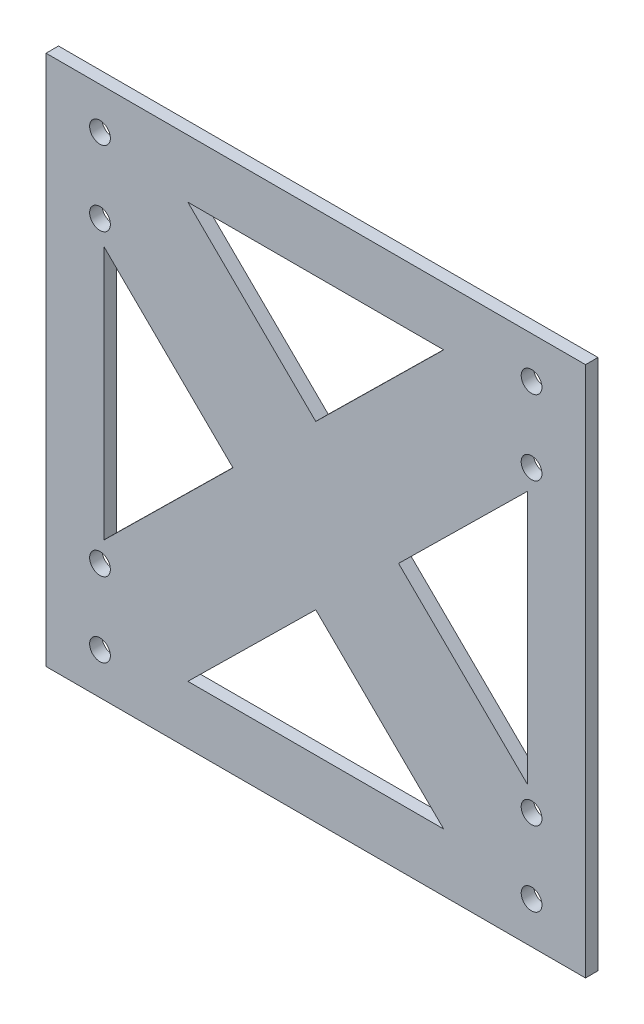
ISO-10303-21;
HEADER;
FILE_DESCRIPTION(('STEP AP214'),'2;1');
FILE_NAME('part.step','',(''),(''),'','','');
FILE_SCHEMA(('AUTOMOTIVE_DESIGN { 1 0 10303 214 1 1 1 1 }'));
ENDSEC;
DATA;
#1=APPLICATION_CONTEXT('core data for automotive mechanical design processes');
#2=APPLICATION_PROTOCOL_DEFINITION('international standard','automotive_design',2000,#1);
#3=PRODUCT_CONTEXT('',#1,'mechanical');
#4=PRODUCT('Part','Part','',(#3));
#5=PRODUCT_RELATED_PRODUCT_CATEGORY('part','',(#4));
#6=PRODUCT_DEFINITION_FORMATION('','',#4);
#7=PRODUCT_DEFINITION_CONTEXT('part definition',#1,'design');
#8=PRODUCT_DEFINITION('design','',#6,#7);
#9=PRODUCT_DEFINITION_SHAPE('','',#8);
#10=(LENGTH_UNIT() NAMED_UNIT(*) SI_UNIT(.MILLI.,.METRE.));
#11=(NAMED_UNIT(*) PLANE_ANGLE_UNIT() SI_UNIT($,.RADIAN.));
#12=(NAMED_UNIT(*) SI_UNIT($,.STERADIAN.) SOLID_ANGLE_UNIT());
#13=UNCERTAINTY_MEASURE_WITH_UNIT(LENGTH_MEASURE(1.E-05),#10,'distance_accuracy_value','');
#14=(GEOMETRIC_REPRESENTATION_CONTEXT(3) GLOBAL_UNCERTAINTY_ASSIGNED_CONTEXT((#13)) GLOBAL_UNIT_ASSIGNED_CONTEXT((#10,
#11,#12)) REPRESENTATION_CONTEXT('',''));
#15=CARTESIAN_POINT('',(0.,0.,0.));
#16=DIRECTION('',(0.,0.,1.));
#17=DIRECTION('',(1.,0.,0.));
#18=AXIS2_PLACEMENT_3D('',#15,#16,#17);
#19=CARTESIAN_POINT('',(0.,0.,3.));
#20=DIRECTION('',(0.,0.,-1.));
#21=DIRECTION('',(-1.,0.,0.));
#22=AXIS2_PLACEMENT_3D('',#19,#20,#21);
#23=PLANE('',#22);
#24=CARTESIAN_POINT('',(52.,36.,3.));
#25=DIRECTION('',(0.,0.,-1.));
#26=DIRECTION('',(-1.,0.,0.));
#27=AXIS2_PLACEMENT_3D('',#24,#25,#26);
#28=CIRCLE('',#27,2.5);
#29=CARTESIAN_POINT('',(49.5,36.,3.));
#30=VERTEX_POINT('',#29);
#31=EDGE_CURVE('E511',#30,#30,#28,.T.);
#32=ORIENTED_EDGE('',*,*,#31,.T.);
#33=EDGE_LOOP('',(#32));
#34=FACE_BOUND('',#33,.T.);
#35=CARTESIAN_POINT('',(-52.,-36.,3.));
#36=DIRECTION('',(0.,0.,-1.));
#37=DIRECTION('',(-1.,0.,0.));
#38=AXIS2_PLACEMENT_3D('',#35,#36,#37);
#39=CIRCLE('',#38,2.5);
#40=CARTESIAN_POINT('',(-54.5,-36.,3.));
#41=VERTEX_POINT('',#40);
#42=EDGE_CURVE('E515',#41,#41,#39,.T.);
#43=ORIENTED_EDGE('',*,*,#42,.T.);
#44=EDGE_LOOP('',(#43));
#45=FACE_BOUND('',#44,.T.);
#46=CARTESIAN_POINT('',(-52.,-54.,3.));
#47=DIRECTION('',(0.,0.,-1.));
#48=DIRECTION('',(-1.,0.,0.));
#49=AXIS2_PLACEMENT_3D('',#46,#47,#48);
#50=CIRCLE('',#49,2.5);
#51=CARTESIAN_POINT('',(-54.5,-54.,3.));
#52=VERTEX_POINT('',#51);
#53=EDGE_CURVE('E534',#52,#52,#50,.T.);
#54=ORIENTED_EDGE('',*,*,#53,.T.);
#55=EDGE_LOOP('',(#54));
#56=FACE_BOUND('',#55,.T.);
#57=CARTESIAN_POINT('',(52.,-36.,3.));
#58=DIRECTION('',(0.,0.,-1.));
#59=DIRECTION('',(-1.,0.,0.));
#60=AXIS2_PLACEMENT_3D('',#57,#58,#59);
#61=CIRCLE('',#60,2.5);
#62=CARTESIAN_POINT('',(49.5,-36.,3.));
#63=VERTEX_POINT('',#62);
#64=EDGE_CURVE('E528',#63,#63,#61,.T.);
#65=ORIENTED_EDGE('',*,*,#64,.T.);
#66=EDGE_LOOP('',(#65));
#67=FACE_BOUND('',#66,.T.);
#68=CARTESIAN_POINT('',(52.,54.,3.));
#69=DIRECTION('',(0.,0.,-1.));
#70=DIRECTION('',(-1.,0.,0.));
#71=AXIS2_PLACEMENT_3D('',#68,#69,#70);
#72=CIRCLE('',#71,2.5);
#73=CARTESIAN_POINT('',(49.5,54.,3.));
#74=VERTEX_POINT('',#73);
#75=EDGE_CURVE('E568',#74,#74,#72,.T.);
#76=ORIENTED_EDGE('',*,*,#75,.T.);
#77=EDGE_LOOP('',(#76));
#78=FACE_BOUND('',#77,.T.);
#79=CARTESIAN_POINT('',(-52.,54.,3.));
#80=DIRECTION('',(0.,0.,-1.));
#81=DIRECTION('',(-1.,0.,0.));
#82=AXIS2_PLACEMENT_3D('',#79,#80,#81);
#83=CIRCLE('',#82,2.5);
#84=CARTESIAN_POINT('',(-54.5,54.,3.));
#85=VERTEX_POINT('',#84);
#86=EDGE_CURVE('E562',#85,#85,#83,.T.);
#87=ORIENTED_EDGE('',*,*,#86,.T.);
#88=EDGE_LOOP('',(#87));
#89=FACE_BOUND('',#88,.T.);
#90=CARTESIAN_POINT('',(-52.,36.,3.));
#91=DIRECTION('',(0.,0.,-1.));
#92=DIRECTION('',(-1.,0.,0.));
#93=AXIS2_PLACEMENT_3D('',#90,#91,#92);
#94=CIRCLE('',#93,2.5);
#95=CARTESIAN_POINT('',(-54.5,36.,3.));
#96=VERTEX_POINT('',#95);
#97=EDGE_CURVE('E556',#96,#96,#94,.T.);
#98=ORIENTED_EDGE('',*,*,#97,.T.);
#99=EDGE_LOOP('',(#98));
#100=FACE_BOUND('',#99,.T.);
#101=CARTESIAN_POINT('',(52.,-54.,3.));
#102=DIRECTION('',(0.,0.,-1.));
#103=DIRECTION('',(-1.,0.,0.));
#104=AXIS2_PLACEMENT_3D('',#101,#102,#103);
#105=CIRCLE('',#104,2.5);
#106=CARTESIAN_POINT('',(49.5,-54.,3.));
#107=VERTEX_POINT('',#106);
#108=EDGE_CURVE('E172',#107,#107,#105,.T.);
#109=ORIENTED_EDGE('',*,*,#108,.T.);
#110=EDGE_LOOP('',(#109));
#111=FACE_BOUND('',#110,.T.);
#112=DIRECTION('',(0.712566819448411,-0.701604252995359,0.));
#113=VECTOR('',#112,1.);
#114=CARTESIAN_POINT('',(51.,-30.5681043633554,3.));
#115=LINE('',#114,#113);
#116=CARTESIAN_POINT('',(19.9542690059671,0.,3.));
#117=VERTEX_POINT('',#116);
#118=CARTESIAN_POINT('',(51.,-30.5681043633554,3.));
#119=VERTEX_POINT('',#118);
#120=EDGE_CURVE('E178',#117,#119,#115,.T.);
#121=ORIENTED_EDGE('',*,*,#120,.F.);
#122=DIRECTION('',(-0.712566819448411,-0.701604252995359,0.));
#123=VECTOR('',#122,1.);
#124=CARTESIAN_POINT('',(19.9542690059671,0.,3.));
#125=LINE('',#124,#123);
#126=CARTESIAN_POINT('',(51.,30.5681043633554,3.));
#127=VERTEX_POINT('',#126);
#128=EDGE_CURVE('E184',#127,#117,#125,.T.);
#129=ORIENTED_EDGE('',*,*,#128,.F.);
#130=DIRECTION('',(0.,1.,0.));
#131=VECTOR('',#130,1.);
#132=CARTESIAN_POINT('',(51.,-30.5681043633554,3.));
#133=LINE('',#132,#131);
#134=EDGE_CURVE('E180',#119,#127,#133,.T.);
#135=ORIENTED_EDGE('',*,*,#134,.F.);
#136=EDGE_LOOP('',(#121,#129,#135));
#137=FACE_BOUND('',#136,.T.);
#138=DIRECTION('',(0.712566819448411,-0.701604252995359,0.));
#139=VECTOR('',#138,1.);
#140=CARTESIAN_POINT('',(-30.8269809940329,50.,3.));
#141=LINE('',#140,#139);
#142=CARTESIAN_POINT('',(-30.8269809940329,50.,3.));
#143=VERTEX_POINT('',#142);
#144=CARTESIAN_POINT('',(0.,19.6472802520292,3.));
#145=VERTEX_POINT('',#144);
#146=EDGE_CURVE('E226',#143,#145,#141,.T.);
#147=ORIENTED_EDGE('',*,*,#146,.F.);
#148=DIRECTION('',(-1.,0.,0.));
#149=VECTOR('',#148,1.);
#150=CARTESIAN_POINT('',(-30.8269809940329,50.,3.));
#151=LINE('',#150,#149);
#152=CARTESIAN_POINT('',(30.8269809940329,50.,3.));
#153=VERTEX_POINT('',#152);
#154=EDGE_CURVE('E232',#153,#143,#151,.T.);
#155=ORIENTED_EDGE('',*,*,#154,.F.);
#156=DIRECTION('',(0.712566819448411,0.701604252995359,0.));
#157=VECTOR('',#156,1.);
#158=CARTESIAN_POINT('',(0.,19.6472802520292,3.));
#159=LINE('',#158,#157);
#160=EDGE_CURVE('E228',#145,#153,#159,.T.);
#161=ORIENTED_EDGE('',*,*,#160,.F.);
#162=EDGE_LOOP('',(#147,#155,#161));
#163=FACE_BOUND('',#162,.T.);
#164=DIRECTION('',(0.,1.,0.));
#165=VECTOR('',#164,1.);
#166=CARTESIAN_POINT('',(65.,-64.,3.));
#167=LINE('',#166,#165);
#168=CARTESIAN_POINT('',(65.,-64.,3.));
#169=VERTEX_POINT('',#168);
#170=CARTESIAN_POINT('',(65.,64.,3.));
#171=VERTEX_POINT('',#170);
#172=EDGE_CURVE('E250',#169,#171,#167,.T.);
#173=ORIENTED_EDGE('',*,*,#172,.T.);
#174=DIRECTION('',(-1.,0.,0.));
#175=VECTOR('',#174,1.);
#176=CARTESIAN_POINT('',(-65.,64.,3.));
#177=LINE('',#176,#175);
#178=CARTESIAN_POINT('',(-65.,64.,3.));
#179=VERTEX_POINT('',#178);
#180=EDGE_CURVE('E253',#171,#179,#177,.T.);
#181=ORIENTED_EDGE('',*,*,#180,.T.);
#182=DIRECTION('',(0.,-1.,0.));
#183=VECTOR('',#182,1.);
#184=CARTESIAN_POINT('',(-65.,-64.,3.));
#185=LINE('',#184,#183);
#186=CARTESIAN_POINT('',(-65.,-64.,3.));
#187=VERTEX_POINT('',#186);
#188=EDGE_CURVE('E256',#179,#187,#185,.T.);
#189=ORIENTED_EDGE('',*,*,#188,.T.);
#190=DIRECTION('',(1.,0.,0.));
#191=VECTOR('',#190,1.);
#192=CARTESIAN_POINT('',(-65.,-64.,3.));
#193=LINE('',#192,#191);
#194=EDGE_CURVE('E258',#187,#169,#193,.T.);
#195=ORIENTED_EDGE('',*,*,#194,.T.);
#196=EDGE_LOOP('',(#173,#181,#189,#195));
#197=FACE_BOUND('',#196,.T.);
#198=DIRECTION('',(0.,-1.,0.));
#199=VECTOR('',#198,1.);
#200=CARTESIAN_POINT('',(-51.,-30.5681043633555,3.));
#201=LINE('',#200,#199);
#202=CARTESIAN_POINT('',(-51.,30.5681043633555,3.));
#203=VERTEX_POINT('',#202);
#204=CARTESIAN_POINT('',(-51.,-30.5681043633555,3.));
#205=VERTEX_POINT('',#204);
#206=EDGE_CURVE('E202',#203,#205,#201,.T.);
#207=ORIENTED_EDGE('',*,*,#206,.F.);
#208=DIRECTION('',(-0.712566819448411,0.701604252995359,0.));
#209=VECTOR('',#208,1.);
#210=CARTESIAN_POINT('',(-51.,30.5681043633555,3.));
#211=LINE('',#210,#209);
#212=CARTESIAN_POINT('',(-19.9542690059671,0.,3.));
#213=VERTEX_POINT('',#212);
#214=EDGE_CURVE('E208',#213,#203,#211,.T.);
#215=ORIENTED_EDGE('',*,*,#214,.F.);
#216=DIRECTION('',(0.712566819448411,0.701604252995359,0.));
#217=VECTOR('',#216,1.);
#218=CARTESIAN_POINT('',(-51.,-30.5681043633555,3.));
#219=LINE('',#218,#217);
#220=EDGE_CURVE('E204',#205,#213,#219,.T.);
#221=ORIENTED_EDGE('',*,*,#220,.F.);
#222=EDGE_LOOP('',(#207,#215,#221));
#223=FACE_BOUND('',#222,.T.);
#224=DIRECTION('',(1.,0.,0.));
#225=VECTOR('',#224,1.);
#226=CARTESIAN_POINT('',(-30.8269809940329,-50.,3.));
#227=LINE('',#226,#225);
#228=CARTESIAN_POINT('',(-30.8269809940329,-50.,3.));
#229=VERTEX_POINT('',#228);
#230=CARTESIAN_POINT('',(30.8269809940329,-50.,3.));
#231=VERTEX_POINT('',#230);
#232=EDGE_CURVE('E149',#229,#231,#227,.T.);
#233=ORIENTED_EDGE('',*,*,#232,.F.);
#234=DIRECTION('',(-0.712566819448411,-0.701604252995359,0.));
#235=VECTOR('',#234,1.);
#236=CARTESIAN_POINT('',(-30.8269809940329,-50.,3.));
#237=LINE('',#236,#235);
#238=CARTESIAN_POINT('',(0.,-19.6472802520292,3.));
#239=VERTEX_POINT('',#238);
#240=EDGE_CURVE('E166',#239,#229,#237,.T.);
#241=ORIENTED_EDGE('',*,*,#240,.F.);
#242=DIRECTION('',(-0.712566819448411,0.701604252995359,0.));
#243=VECTOR('',#242,1.);
#244=CARTESIAN_POINT('',(30.8269809940329,-50.,3.));
#245=LINE('',#244,#243);
#246=EDGE_CURVE('E157',#231,#239,#245,.T.);
#247=ORIENTED_EDGE('',*,*,#246,.F.);
#248=EDGE_LOOP('',(#233,#241,#247));
#249=FACE_BOUND('',#248,.T.);
#250=ADVANCED_FACE('F36',(#34,#45,#56,#67,#78,#89,#100,#111,#137,#163,#197,#223,#249),#23,.F.);
#251=CARTESIAN_POINT('',(0.,0.,0.));
#252=DIRECTION('',(0.,0.,-1.));
#253=DIRECTION('',(-1.,0.,0.));
#254=AXIS2_PLACEMENT_3D('',#251,#252,#253);
#255=PLANE('',#254);
#256=CARTESIAN_POINT('',(52.,36.,0.));
#257=DIRECTION('',(0.,0.,-1.));
#258=DIRECTION('',(-1.,0.,0.));
#259=AXIS2_PLACEMENT_3D('',#256,#257,#258);
#260=CIRCLE('',#259,2.5);
#261=CARTESIAN_POINT('',(49.5,36.,0.));
#262=VERTEX_POINT('',#261);
#263=EDGE_CURVE('E514',#262,#262,#260,.T.);
#264=ORIENTED_EDGE('',*,*,#263,.F.);
#265=EDGE_LOOP('',(#264));
#266=FACE_BOUND('',#265,.T.);
#267=CARTESIAN_POINT('',(-52.,-36.,0.));
#268=DIRECTION('',(0.,0.,-1.));
#269=DIRECTION('',(-1.,0.,0.));
#270=AXIS2_PLACEMENT_3D('',#267,#268,#269);
#271=CIRCLE('',#270,2.5);
#272=CARTESIAN_POINT('',(-54.5,-36.,0.));
#273=VERTEX_POINT('',#272);
#274=EDGE_CURVE('E518',#273,#273,#271,.T.);
#275=ORIENTED_EDGE('',*,*,#274,.F.);
#276=EDGE_LOOP('',(#275));
#277=FACE_BOUND('',#276,.T.);
#278=CARTESIAN_POINT('',(-52.,-54.,0.));
#279=DIRECTION('',(0.,0.,-1.));
#280=DIRECTION('',(-1.,0.,0.));
#281=AXIS2_PLACEMENT_3D('',#278,#279,#280);
#282=CIRCLE('',#281,2.5);
#283=CARTESIAN_POINT('',(-54.5,-54.,0.));
#284=VERTEX_POINT('',#283);
#285=EDGE_CURVE('E531',#284,#284,#282,.T.);
#286=ORIENTED_EDGE('',*,*,#285,.F.);
#287=EDGE_LOOP('',(#286));
#288=FACE_BOUND('',#287,.T.);
#289=CARTESIAN_POINT('',(52.,-36.,0.));
#290=DIRECTION('',(0.,0.,-1.));
#291=DIRECTION('',(-1.,0.,0.));
#292=AXIS2_PLACEMENT_3D('',#289,#290,#291);
#293=CIRCLE('',#292,2.5);
#294=CARTESIAN_POINT('',(49.5,-36.,0.));
#295=VERTEX_POINT('',#294);
#296=EDGE_CURVE('E524',#295,#295,#293,.T.);
#297=ORIENTED_EDGE('',*,*,#296,.F.);
#298=EDGE_LOOP('',(#297));
#299=FACE_BOUND('',#298,.T.);
#300=CARTESIAN_POINT('',(52.,54.,0.));
#301=DIRECTION('',(0.,0.,-1.));
#302=DIRECTION('',(-1.,0.,0.));
#303=AXIS2_PLACEMENT_3D('',#300,#301,#302);
#304=CIRCLE('',#303,2.5);
#305=CARTESIAN_POINT('',(49.5,54.,0.));
#306=VERTEX_POINT('',#305);
#307=EDGE_CURVE('E520',#306,#306,#304,.T.);
#308=ORIENTED_EDGE('',*,*,#307,.F.);
#309=EDGE_LOOP('',(#308));
#310=FACE_BOUND('',#309,.T.);
#311=CARTESIAN_POINT('',(-52.,54.,0.));
#312=DIRECTION('',(0.,0.,-1.));
#313=DIRECTION('',(-1.,0.,0.));
#314=AXIS2_PLACEMENT_3D('',#311,#312,#313);
#315=CIRCLE('',#314,2.5);
#316=CARTESIAN_POINT('',(-54.5,54.,0.));
#317=VERTEX_POINT('',#316);
#318=EDGE_CURVE('E565',#317,#317,#315,.T.);
#319=ORIENTED_EDGE('',*,*,#318,.F.);
#320=EDGE_LOOP('',(#319));
#321=FACE_BOUND('',#320,.T.);
#322=CARTESIAN_POINT('',(-52.,36.,0.));
#323=DIRECTION('',(0.,0.,-1.));
#324=DIRECTION('',(-1.,0.,0.));
#325=AXIS2_PLACEMENT_3D('',#322,#323,#324);
#326=CIRCLE('',#325,2.5);
#327=CARTESIAN_POINT('',(-54.5,36.,0.));
#328=VERTEX_POINT('',#327);
#329=EDGE_CURVE('E559',#328,#328,#326,.T.);
#330=ORIENTED_EDGE('',*,*,#329,.F.);
#331=EDGE_LOOP('',(#330));
#332=FACE_BOUND('',#331,.T.);
#333=CARTESIAN_POINT('',(52.,-54.,0.));
#334=DIRECTION('',(0.,0.,-1.));
#335=DIRECTION('',(-1.,0.,0.));
#336=AXIS2_PLACEMENT_3D('',#333,#334,#335);
#337=CIRCLE('',#336,2.5);
#338=CARTESIAN_POINT('',(49.5,-54.,0.));
#339=VERTEX_POINT('',#338);
#340=EDGE_CURVE('E527',#339,#339,#337,.T.);
#341=ORIENTED_EDGE('',*,*,#340,.F.);
#342=EDGE_LOOP('',(#341));
#343=FACE_BOUND('',#342,.T.);
#344=DIRECTION('',(0.,1.,0.));
#345=VECTOR('',#344,1.);
#346=CARTESIAN_POINT('',(65.,-64.,0.));
#347=LINE('',#346,#345);
#348=CARTESIAN_POINT('',(65.,-64.,0.));
#349=VERTEX_POINT('',#348);
#350=CARTESIAN_POINT('',(65.,64.,0.));
#351=VERTEX_POINT('',#350);
#352=EDGE_CURVE('E249',#349,#351,#347,.T.);
#353=ORIENTED_EDGE('',*,*,#352,.F.);
#354=DIRECTION('',(1.,0.,0.));
#355=VECTOR('',#354,1.);
#356=CARTESIAN_POINT('',(-65.,-64.,0.));
#357=LINE('',#356,#355);
#358=CARTESIAN_POINT('',(-65.,-64.,0.));
#359=VERTEX_POINT('',#358);
#360=EDGE_CURVE('E254',#359,#349,#357,.T.);
#361=ORIENTED_EDGE('',*,*,#360,.F.);
#362=DIRECTION('',(0.,-1.,0.));
#363=VECTOR('',#362,1.);
#364=CARTESIAN_POINT('',(-65.,-64.,0.));
#365=LINE('',#364,#363);
#366=CARTESIAN_POINT('',(-65.,64.,0.));
#367=VERTEX_POINT('',#366);
#368=EDGE_CURVE('E265',#367,#359,#365,.T.);
#369=ORIENTED_EDGE('',*,*,#368,.F.);
#370=DIRECTION('',(-1.,0.,0.));
#371=VECTOR('',#370,1.);
#372=CARTESIAN_POINT('',(-65.,64.,0.));
#373=LINE('',#372,#371);
#374=EDGE_CURVE('E263',#351,#367,#373,.T.);
#375=ORIENTED_EDGE('',*,*,#374,.F.);
#376=EDGE_LOOP('',(#353,#361,#369,#375));
#377=FACE_BOUND('',#376,.T.);
#378=DIRECTION('',(-1.,0.,0.));
#379=VECTOR('',#378,1.);
#380=CARTESIAN_POINT('',(-30.8269809940329,50.,0.));
#381=LINE('',#380,#379);
#382=CARTESIAN_POINT('',(30.8269809940329,50.,0.));
#383=VERTEX_POINT('',#382);
#384=CARTESIAN_POINT('',(-30.8269809940329,50.,0.));
#385=VERTEX_POINT('',#384);
#386=EDGE_CURVE('E229',#383,#385,#381,.T.);
#387=ORIENTED_EDGE('',*,*,#386,.T.);
#388=DIRECTION('',(0.712566819448411,-0.701604252995359,0.));
#389=VECTOR('',#388,1.);
#390=CARTESIAN_POINT('',(-30.8269809940329,50.,0.));
#391=LINE('',#390,#389);
#392=CARTESIAN_POINT('',(0.,19.6472802520292,0.));
#393=VERTEX_POINT('',#392);
#394=EDGE_CURVE('E225',#385,#393,#391,.T.);
#395=ORIENTED_EDGE('',*,*,#394,.T.);
#396=DIRECTION('',(0.712566819448411,0.701604252995359,0.));
#397=VECTOR('',#396,1.);
#398=CARTESIAN_POINT('',(0.,19.6472802520292,0.));
#399=LINE('',#398,#397);
#400=EDGE_CURVE('E237',#393,#383,#399,.T.);
#401=ORIENTED_EDGE('',*,*,#400,.T.);
#402=EDGE_LOOP('',(#387,#395,#401));
#403=FACE_BOUND('',#402,.T.);
#404=DIRECTION('',(-0.712566819448411,0.701604252995359,0.));
#405=VECTOR('',#404,1.);
#406=CARTESIAN_POINT('',(-51.,30.5681043633555,0.));
#407=LINE('',#406,#405);
#408=CARTESIAN_POINT('',(-19.9542690059671,0.,0.));
#409=VERTEX_POINT('',#408);
#410=CARTESIAN_POINT('',(-51.,30.5681043633555,0.));
#411=VERTEX_POINT('',#410);
#412=EDGE_CURVE('E205',#409,#411,#407,.T.);
#413=ORIENTED_EDGE('',*,*,#412,.T.);
#414=DIRECTION('',(0.,-1.,0.));
#415=VECTOR('',#414,1.);
#416=CARTESIAN_POINT('',(-51.,-30.5681043633555,0.));
#417=LINE('',#416,#415);
#418=CARTESIAN_POINT('',(-51.,-30.5681043633555,0.));
#419=VERTEX_POINT('',#418);
#420=EDGE_CURVE('E201',#411,#419,#417,.T.);
#421=ORIENTED_EDGE('',*,*,#420,.T.);
#422=DIRECTION('',(0.712566819448411,0.701604252995359,0.));
#423=VECTOR('',#422,1.);
#424=CARTESIAN_POINT('',(-51.,-30.5681043633555,0.));
#425=LINE('',#424,#423);
#426=EDGE_CURVE('E213',#419,#409,#425,.T.);
#427=ORIENTED_EDGE('',*,*,#426,.T.);
#428=EDGE_LOOP('',(#413,#421,#427));
#429=FACE_BOUND('',#428,.T.);
#430=DIRECTION('',(-0.712566819448411,-0.701604252995359,0.));
#431=VECTOR('',#430,1.);
#432=CARTESIAN_POINT('',(19.9542690059671,0.,0.));
#433=LINE('',#432,#431);
#434=CARTESIAN_POINT('',(51.,30.5681043633554,0.));
#435=VERTEX_POINT('',#434);
#436=CARTESIAN_POINT('',(19.9542690059671,0.,0.));
#437=VERTEX_POINT('',#436);
#438=EDGE_CURVE('E181',#435,#437,#433,.T.);
#439=ORIENTED_EDGE('',*,*,#438,.T.);
#440=DIRECTION('',(0.712566819448411,-0.701604252995359,0.));
#441=VECTOR('',#440,1.);
#442=CARTESIAN_POINT('',(51.,-30.5681043633554,0.));
#443=LINE('',#442,#441);
#444=CARTESIAN_POINT('',(51.,-30.5681043633554,0.));
#445=VERTEX_POINT('',#444);
#446=EDGE_CURVE('E164',#437,#445,#443,.T.);
#447=ORIENTED_EDGE('',*,*,#446,.T.);
#448=DIRECTION('',(0.,1.,0.));
#449=VECTOR('',#448,1.);
#450=CARTESIAN_POINT('',(51.,-30.5681043633554,0.));
#451=LINE('',#450,#449);
#452=EDGE_CURVE('E189',#445,#435,#451,.T.);
#453=ORIENTED_EDGE('',*,*,#452,.T.);
#454=EDGE_LOOP('',(#439,#447,#453));
#455=FACE_BOUND('',#454,.T.);
#456=DIRECTION('',(-0.712566819448411,-0.701604252995359,0.));
#457=VECTOR('',#456,1.);
#458=CARTESIAN_POINT('',(-30.8269809940329,-50.,0.));
#459=LINE('',#458,#457);
#460=CARTESIAN_POINT('',(0.,-19.6472802520292,0.));
#461=VERTEX_POINT('',#460);
#462=CARTESIAN_POINT('',(-30.8269809940329,-50.,0.));
#463=VERTEX_POINT('',#462);
#464=EDGE_CURVE('E158',#461,#463,#459,.T.);
#465=ORIENTED_EDGE('',*,*,#464,.T.);
#466=DIRECTION('',(1.,0.,0.));
#467=VECTOR('',#466,1.);
#468=CARTESIAN_POINT('',(-30.8269809940329,-50.,0.));
#469=LINE('',#468,#467);
#470=CARTESIAN_POINT('',(30.8269809940329,-50.,0.));
#471=VERTEX_POINT('',#470);
#472=EDGE_CURVE('E59',#463,#471,#469,.T.);
#473=ORIENTED_EDGE('',*,*,#472,.T.);
#474=DIRECTION('',(-0.712566819448411,0.701604252995359,0.));
#475=VECTOR('',#474,1.);
#476=CARTESIAN_POINT('',(30.8269809940329,-50.,0.));
#477=LINE('',#476,#475);
#478=EDGE_CURVE('E163',#471,#461,#477,.T.);
#479=ORIENTED_EDGE('',*,*,#478,.T.);
#480=EDGE_LOOP('',(#465,#473,#479));
#481=FACE_BOUND('',#480,.T.);
#482=ADVANCED_FACE('F283',(#266,#277,#288,#299,#310,#321,#332,#343,#377,#403,#429,#455,#481),
#255,.T.);
#483=CARTESIAN_POINT('',(65.,-64.,3.));
#484=DIRECTION('',(-1.,0.,0.));
#485=DIRECTION('',(0.,0.,1.));
#486=AXIS2_PLACEMENT_3D('',#483,#484,#485);
#487=PLANE('',#486);
#488=ORIENTED_EDGE('',*,*,#352,.T.);
#489=DIRECTION('',(0.,0.,-1.));
#490=VECTOR('',#489,1.);
#491=CARTESIAN_POINT('',(65.,64.,3.));
#492=LINE('',#491,#490);
#493=EDGE_CURVE('E11',#171,#351,#492,.T.);
#494=ORIENTED_EDGE('',*,*,#493,.F.);
#495=ORIENTED_EDGE('',*,*,#172,.F.);
#496=DIRECTION('',(0.,0.,-1.));
#497=VECTOR('',#496,1.);
#498=CARTESIAN_POINT('',(65.,-64.,3.));
#499=LINE('',#498,#497);
#500=EDGE_CURVE('E260',#169,#349,#499,.T.);
#501=ORIENTED_EDGE('',*,*,#500,.T.);
#502=EDGE_LOOP('',(#488,#494,#495,#501));
#503=FACE_BOUND('',#502,.T.);
#504=ADVANCED_FACE('F38',(#503),#487,.F.);
#505=CARTESIAN_POINT('',(-65.,64.,3.));
#506=DIRECTION('',(0.,-1.,0.));
#507=DIRECTION('',(0.,0.,-1.));
#508=AXIS2_PLACEMENT_3D('',#505,#506,#507);
#509=PLANE('',#508);
#510=ORIENTED_EDGE('',*,*,#374,.T.);
#511=DIRECTION('',(0.,0.,-1.));
#512=VECTOR('',#511,1.);
#513=CARTESIAN_POINT('',(-65.,64.,3.));
#514=LINE('',#513,#512);
#515=EDGE_CURVE('E44',#179,#367,#514,.T.);
#516=ORIENTED_EDGE('',*,*,#515,.F.);
#517=ORIENTED_EDGE('',*,*,#180,.F.);
#518=ORIENTED_EDGE('',*,*,#493,.T.);
#519=EDGE_LOOP('',(#510,#516,#517,#518));
#520=FACE_BOUND('',#519,.T.);
#521=ADVANCED_FACE('F294',(#520),#509,.F.);
#522=CARTESIAN_POINT('',(-65.,-64.,3.));
#523=DIRECTION('',(1.,0.,0.));
#524=DIRECTION('',(0.,0.,-1.));
#525=AXIS2_PLACEMENT_3D('',#522,#523,#524);
#526=PLANE('',#525);
#527=ORIENTED_EDGE('',*,*,#368,.T.);
#528=DIRECTION('',(0.,0.,-1.));
#529=VECTOR('',#528,1.);
#530=CARTESIAN_POINT('',(-65.,-64.,3.));
#531=LINE('',#530,#529);
#532=EDGE_CURVE('E270',#187,#359,#531,.T.);
#533=ORIENTED_EDGE('',*,*,#532,.F.);
#534=ORIENTED_EDGE('',*,*,#188,.F.);
#535=ORIENTED_EDGE('',*,*,#515,.T.);
#536=EDGE_LOOP('',(#527,#533,#534,#535));
#537=FACE_BOUND('',#536,.T.);
#538=ADVANCED_FACE('F277',(#537),#526,.F.);
#539=CARTESIAN_POINT('',(-65.,-64.,3.));
#540=DIRECTION('',(0.,1.,0.));
#541=DIRECTION('',(0.,0.,1.));
#542=AXIS2_PLACEMENT_3D('',#539,#540,#541);
#543=PLANE('',#542);
#544=ORIENTED_EDGE('',*,*,#360,.T.);
#545=ORIENTED_EDGE('',*,*,#500,.F.);
#546=ORIENTED_EDGE('',*,*,#194,.F.);
#547=ORIENTED_EDGE('',*,*,#532,.T.);
#548=EDGE_LOOP('',(#544,#545,#546,#547));
#549=FACE_BOUND('',#548,.T.);
#550=ADVANCED_FACE('F287',(#549),#543,.F.);
#551=CARTESIAN_POINT('',(-30.8269809940329,50.,3.));
#552=DIRECTION('',(0.701604252995359,0.712566819448411,0.));
#553=DIRECTION('',(-0.712566819448411,0.701604252995359,0.));
#554=AXIS2_PLACEMENT_3D('',#551,#552,#553);
#555=PLANE('',#554);
#556=ORIENTED_EDGE('',*,*,#394,.F.);
#557=DIRECTION('',(0.,0.,-1.));
#558=VECTOR('',#557,1.);
#559=CARTESIAN_POINT('',(-30.8269809940329,50.,3.));
#560=LINE('',#559,#558);
#561=EDGE_CURVE('E234',#143,#385,#560,.T.);
#562=ORIENTED_EDGE('',*,*,#561,.F.);
#563=ORIENTED_EDGE('',*,*,#146,.T.);
#564=DIRECTION('',(0.,0.,-1.));
#565=VECTOR('',#564,1.);
#566=CARTESIAN_POINT('',(0.,19.6472802520292,3.));
#567=LINE('',#566,#565);
#568=EDGE_CURVE('E246',#145,#393,#567,.T.);
#569=ORIENTED_EDGE('',*,*,#568,.T.);
#570=EDGE_LOOP('',(#556,#562,#563,#569));
#571=FACE_BOUND('',#570,.T.);
#572=ADVANCED_FACE('F312',(#571),#555,.T.);
#573=CARTESIAN_POINT('',(0.,19.6472802520292,3.));
#574=DIRECTION('',(-0.701604252995359,0.712566819448411,0.));
#575=DIRECTION('',(-0.712566819448411,-0.701604252995359,0.));
#576=AXIS2_PLACEMENT_3D('',#573,#574,#575);
#577=PLANE('',#576);
#578=ORIENTED_EDGE('',*,*,#400,.F.);
#579=ORIENTED_EDGE('',*,*,#568,.F.);
#580=ORIENTED_EDGE('',*,*,#160,.T.);
#581=DIRECTION('',(0.,0.,-1.));
#582=VECTOR('',#581,1.);
#583=CARTESIAN_POINT('',(30.8269809940329,50.,3.));
#584=LINE('',#583,#582);
#585=EDGE_CURVE('E244',#153,#383,#584,.T.);
#586=ORIENTED_EDGE('',*,*,#585,.T.);
#587=EDGE_LOOP('',(#578,#579,#580,#586));
#588=FACE_BOUND('',#587,.T.);
#589=ADVANCED_FACE('F319',(#588),#577,.T.);
#590=CARTESIAN_POINT('',(-30.8269809940329,50.,3.));
#591=DIRECTION('',(0.,-1.,0.));
#592=DIRECTION('',(0.,0.,-1.));
#593=AXIS2_PLACEMENT_3D('',#590,#591,#592);
#594=PLANE('',#593);
#595=ORIENTED_EDGE('',*,*,#386,.F.);
#596=ORIENTED_EDGE('',*,*,#585,.F.);
#597=ORIENTED_EDGE('',*,*,#154,.T.);
#598=ORIENTED_EDGE('',*,*,#561,.T.);
#599=EDGE_LOOP('',(#595,#596,#597,#598));
#600=FACE_BOUND('',#599,.T.);
#601=ADVANCED_FACE('F324',(#600),#594,.T.);
#602=CARTESIAN_POINT('',(-51.,-30.5681043633555,3.));
#603=DIRECTION('',(1.,0.,0.));
#604=DIRECTION('',(0.,0.,-1.));
#605=AXIS2_PLACEMENT_3D('',#602,#603,#604);
#606=PLANE('',#605);
#607=ORIENTED_EDGE('',*,*,#420,.F.);
#608=DIRECTION('',(0.,0.,-1.));
#609=VECTOR('',#608,1.);
#610=CARTESIAN_POINT('',(-51.,30.5681043633555,3.));
#611=LINE('',#610,#609);
#612=EDGE_CURVE('E210',#203,#411,#611,.T.);
#613=ORIENTED_EDGE('',*,*,#612,.F.);
#614=ORIENTED_EDGE('',*,*,#206,.T.);
#615=DIRECTION('',(0.,0.,-1.));
#616=VECTOR('',#615,1.);
#617=CARTESIAN_POINT('',(-51.,-30.5681043633555,3.));
#618=LINE('',#617,#616);
#619=EDGE_CURVE('E222',#205,#419,#618,.T.);
#620=ORIENTED_EDGE('',*,*,#619,.T.);
#621=EDGE_LOOP('',(#607,#613,#614,#620));
#622=FACE_BOUND('',#621,.T.);
#623=ADVANCED_FACE('F374',(#622),#606,.T.);
#624=CARTESIAN_POINT('',(-51.,-30.5681043633555,3.));
#625=DIRECTION('',(-0.701604252995359,0.712566819448411,0.));
#626=DIRECTION('',(-0.712566819448411,-0.701604252995359,0.));
#627=AXIS2_PLACEMENT_3D('',#624,#625,#626);
#628=PLANE('',#627);
#629=ORIENTED_EDGE('',*,*,#426,.F.);
#630=ORIENTED_EDGE('',*,*,#619,.F.);
#631=ORIENTED_EDGE('',*,*,#220,.T.);
#632=DIRECTION('',(0.,0.,-1.));
#633=VECTOR('',#632,1.);
#634=CARTESIAN_POINT('',(-19.9542690059671,0.,3.));
#635=LINE('',#634,#633);
#636=EDGE_CURVE('E220',#213,#409,#635,.T.);
#637=ORIENTED_EDGE('',*,*,#636,.T.);
#638=EDGE_LOOP('',(#629,#630,#631,#637));
#639=FACE_BOUND('',#638,.T.);
#640=ADVANCED_FACE('F370',(#639),#628,.T.);
#641=CARTESIAN_POINT('',(-51.,30.5681043633555,3.));
#642=DIRECTION('',(-0.701604252995359,-0.712566819448411,0.));
#643=DIRECTION('',(0.712566819448411,-0.701604252995359,0.));
#644=AXIS2_PLACEMENT_3D('',#641,#642,#643);
#645=PLANE('',#644);
#646=ORIENTED_EDGE('',*,*,#412,.F.);
#647=ORIENTED_EDGE('',*,*,#636,.F.);
#648=ORIENTED_EDGE('',*,*,#214,.T.);
#649=ORIENTED_EDGE('',*,*,#612,.T.);
#650=EDGE_LOOP('',(#646,#647,#648,#649));
#651=FACE_BOUND('',#650,.T.);
#652=ADVANCED_FACE('F366',(#651),#645,.T.);
#653=CARTESIAN_POINT('',(51.,-30.5681043633554,3.));
#654=DIRECTION('',(0.701604252995358,0.712566819448411,0.));
#655=DIRECTION('',(-0.712566819448411,0.701604252995359,0.));
#656=AXIS2_PLACEMENT_3D('',#653,#654,#655);
#657=PLANE('',#656);
#658=ORIENTED_EDGE('',*,*,#446,.F.);
#659=DIRECTION('',(0.,0.,-1.));
#660=VECTOR('',#659,1.);
#661=CARTESIAN_POINT('',(19.9542690059671,0.,3.));
#662=LINE('',#661,#660);
#663=EDGE_CURVE('E186',#117,#437,#662,.T.);
#664=ORIENTED_EDGE('',*,*,#663,.F.);
#665=ORIENTED_EDGE('',*,*,#120,.T.);
#666=DIRECTION('',(0.,0.,-1.));
#667=VECTOR('',#666,1.);
#668=CARTESIAN_POINT('',(51.,-30.5681043633554,3.));
#669=LINE('',#668,#667);
#670=EDGE_CURVE('E198',#119,#445,#669,.T.);
#671=ORIENTED_EDGE('',*,*,#670,.T.);
#672=EDGE_LOOP('',(#658,#664,#665,#671));
#673=FACE_BOUND('',#672,.T.);
#674=ADVANCED_FACE('F362',(#673),#657,.T.);
#675=CARTESIAN_POINT('',(51.,-30.5681043633554,3.));
#676=DIRECTION('',(-1.,0.,0.));
#677=DIRECTION('',(0.,0.,1.));
#678=AXIS2_PLACEMENT_3D('',#675,#676,#677);
#679=PLANE('',#678);
#680=ORIENTED_EDGE('',*,*,#452,.F.);
#681=ORIENTED_EDGE('',*,*,#670,.F.);
#682=ORIENTED_EDGE('',*,*,#134,.T.);
#683=DIRECTION('',(0.,0.,-1.));
#684=VECTOR('',#683,1.);
#685=CARTESIAN_POINT('',(51.,30.5681043633554,3.));
#686=LINE('',#685,#684);
#687=EDGE_CURVE('E196',#127,#435,#686,.T.);
#688=ORIENTED_EDGE('',*,*,#687,.T.);
#689=EDGE_LOOP('',(#680,#681,#682,#688));
#690=FACE_BOUND('',#689,.T.);
#691=ADVANCED_FACE('F358',(#690),#679,.T.);
#692=CARTESIAN_POINT('',(19.9542690059671,0.,3.));
#693=DIRECTION('',(0.701604252995359,-0.712566819448411,0.));
#694=DIRECTION('',(0.712566819448411,0.701604252995359,0.));
#695=AXIS2_PLACEMENT_3D('',#692,#693,#694);
#696=PLANE('',#695);
#697=ORIENTED_EDGE('',*,*,#438,.F.);
#698=ORIENTED_EDGE('',*,*,#687,.F.);
#699=ORIENTED_EDGE('',*,*,#128,.T.);
#700=ORIENTED_EDGE('',*,*,#663,.T.);
#701=EDGE_LOOP('',(#697,#698,#699,#700));
#702=FACE_BOUND('',#701,.T.);
#703=ADVANCED_FACE('F355',(#702),#696,.T.);
#704=CARTESIAN_POINT('',(-30.8269809940329,-50.,3.));
#705=DIRECTION('',(0.,1.,0.));
#706=DIRECTION('',(0.,0.,1.));
#707=AXIS2_PLACEMENT_3D('',#704,#705,#706);
#708=PLANE('',#707);
#709=ORIENTED_EDGE('',*,*,#472,.F.);
#710=DIRECTION('',(0.,0.,-1.));
#711=VECTOR('',#710,1.);
#712=CARTESIAN_POINT('',(-30.8269809940329,-50.,3.));
#713=LINE('',#712,#711);
#714=EDGE_CURVE('E153',#229,#463,#713,.T.);
#715=ORIENTED_EDGE('',*,*,#714,.F.);
#716=ORIENTED_EDGE('',*,*,#232,.T.);
#717=DIRECTION('',(0.,0.,-1.));
#718=VECTOR('',#717,1.);
#719=CARTESIAN_POINT('',(30.8269809940329,-50.,3.));
#720=LINE('',#719,#718);
#721=EDGE_CURVE('E152',#231,#471,#720,.T.);
#722=ORIENTED_EDGE('',*,*,#721,.T.);
#723=EDGE_LOOP('',(#709,#715,#716,#722));
#724=FACE_BOUND('',#723,.T.);
#725=ADVANCED_FACE('F151',(#724),#708,.T.);
#726=CARTESIAN_POINT('',(30.8269809940329,-50.,3.));
#727=DIRECTION('',(-0.701604252995358,-0.712566819448411,0.));
#728=DIRECTION('',(0.712566819448411,-0.701604252995359,0.));
#729=AXIS2_PLACEMENT_3D('',#726,#727,#728);
#730=PLANE('',#729);
#731=ORIENTED_EDGE('',*,*,#478,.F.);
#732=ORIENTED_EDGE('',*,*,#721,.F.);
#733=ORIENTED_EDGE('',*,*,#246,.T.);
#734=DIRECTION('',(0.,0.,-1.));
#735=VECTOR('',#734,1.);
#736=CARTESIAN_POINT('',(0.,-19.6472802520292,3.));
#737=LINE('',#736,#735);
#738=EDGE_CURVE('E51',#239,#461,#737,.T.);
#739=ORIENTED_EDGE('',*,*,#738,.T.);
#740=EDGE_LOOP('',(#731,#732,#733,#739));
#741=FACE_BOUND('',#740,.T.);
#742=ADVANCED_FACE('F161',(#741),#730,.T.);
#743=CARTESIAN_POINT('',(-30.8269809940329,-50.,3.));
#744=DIRECTION('',(0.701604252995359,-0.712566819448411,0.));
#745=DIRECTION('',(0.712566819448411,0.701604252995359,0.));
#746=AXIS2_PLACEMENT_3D('',#743,#744,#745);
#747=PLANE('',#746);
#748=ORIENTED_EDGE('',*,*,#464,.F.);
#749=ORIENTED_EDGE('',*,*,#738,.F.);
#750=ORIENTED_EDGE('',*,*,#240,.T.);
#751=ORIENTED_EDGE('',*,*,#714,.T.);
#752=EDGE_LOOP('',(#748,#749,#750,#751));
#753=FACE_BOUND('',#752,.T.);
#754=ADVANCED_FACE('F339',(#753),#747,.T.);
#755=CARTESIAN_POINT('',(52.,-54.,3.));
#756=DIRECTION('',(0.,0.,-1.));
#757=DIRECTION('',(-1.,0.,0.));
#758=AXIS2_PLACEMENT_3D('',#755,#756,#757);
#759=CYLINDRICAL_SURFACE('',#758,2.5);
#760=ORIENTED_EDGE('',*,*,#108,.F.);
#761=EDGE_LOOP('',(#760));
#762=FACE_BOUND('',#761,.T.);
#763=ORIENTED_EDGE('',*,*,#340,.T.);
#764=EDGE_LOOP('',(#763));
#765=FACE_BOUND('',#764,.T.);
#766=ADVANCED_FACE('F341',(#762,#765),#759,.F.);
#767=CARTESIAN_POINT('',(-52.,36.,3.));
#768=DIRECTION('',(0.,0.,-1.));
#769=DIRECTION('',(-1.,0.,0.));
#770=AXIS2_PLACEMENT_3D('',#767,#768,#769);
#771=CYLINDRICAL_SURFACE('',#770,2.5);
#772=ORIENTED_EDGE('',*,*,#97,.F.);
#773=EDGE_LOOP('',(#772));
#774=FACE_BOUND('',#773,.T.);
#775=ORIENTED_EDGE('',*,*,#329,.T.);
#776=EDGE_LOOP('',(#775));
#777=FACE_BOUND('',#776,.T.);
#778=ADVANCED_FACE('F347',(#774,#777),#771,.F.);
#779=CARTESIAN_POINT('',(-52.,54.,3.));
#780=DIRECTION('',(0.,0.,-1.));
#781=DIRECTION('',(-1.,0.,0.));
#782=AXIS2_PLACEMENT_3D('',#779,#780,#781);
#783=CYLINDRICAL_SURFACE('',#782,2.5);
#784=ORIENTED_EDGE('',*,*,#86,.F.);
#785=EDGE_LOOP('',(#784));
#786=FACE_BOUND('',#785,.T.);
#787=ORIENTED_EDGE('',*,*,#318,.T.);
#788=EDGE_LOOP('',(#787));
#789=FACE_BOUND('',#788,.T.);
#790=ADVANCED_FACE('F446',(#786,#789),#783,.F.);
#791=CARTESIAN_POINT('',(52.,54.,3.));
#792=DIRECTION('',(0.,0.,-1.));
#793=DIRECTION('',(-1.,0.,0.));
#794=AXIS2_PLACEMENT_3D('',#791,#792,#793);
#795=CYLINDRICAL_SURFACE('',#794,2.5);
#796=ORIENTED_EDGE('',*,*,#75,.F.);
#797=EDGE_LOOP('',(#796));
#798=FACE_BOUND('',#797,.T.);
#799=ORIENTED_EDGE('',*,*,#307,.T.);
#800=EDGE_LOOP('',(#799));
#801=FACE_BOUND('',#800,.T.);
#802=ADVANCED_FACE('F456',(#798,#801),#795,.F.);
#803=CARTESIAN_POINT('',(52.,-36.,3.));
#804=DIRECTION('',(0.,0.,-1.));
#805=DIRECTION('',(-1.,0.,0.));
#806=AXIS2_PLACEMENT_3D('',#803,#804,#805);
#807=CYLINDRICAL_SURFACE('',#806,2.5);
#808=ORIENTED_EDGE('',*,*,#64,.F.);
#809=EDGE_LOOP('',(#808));
#810=FACE_BOUND('',#809,.T.);
#811=ORIENTED_EDGE('',*,*,#296,.T.);
#812=EDGE_LOOP('',(#811));
#813=FACE_BOUND('',#812,.T.);
#814=ADVANCED_FACE('F466',(#810,#813),#807,.F.);
#815=CARTESIAN_POINT('',(-52.,-54.,3.));
#816=DIRECTION('',(0.,0.,-1.));
#817=DIRECTION('',(-1.,0.,0.));
#818=AXIS2_PLACEMENT_3D('',#815,#816,#817);
#819=CYLINDRICAL_SURFACE('',#818,2.5);
#820=ORIENTED_EDGE('',*,*,#53,.F.);
#821=EDGE_LOOP('',(#820));
#822=FACE_BOUND('',#821,.T.);
#823=ORIENTED_EDGE('',*,*,#285,.T.);
#824=EDGE_LOOP('',(#823));
#825=FACE_BOUND('',#824,.T.);
#826=ADVANCED_FACE('F476',(#822,#825),#819,.F.);
#827=CARTESIAN_POINT('',(-52.,-36.,3.));
#828=DIRECTION('',(0.,0.,-1.));
#829=DIRECTION('',(-1.,0.,0.));
#830=AXIS2_PLACEMENT_3D('',#827,#828,#829);
#831=CYLINDRICAL_SURFACE('',#830,2.5);
#832=ORIENTED_EDGE('',*,*,#42,.F.);
#833=EDGE_LOOP('',(#832));
#834=FACE_BOUND('',#833,.T.);
#835=ORIENTED_EDGE('',*,*,#274,.T.);
#836=EDGE_LOOP('',(#835));
#837=FACE_BOUND('',#836,.T.);
#838=ADVANCED_FACE('F486',(#834,#837),#831,.F.);
#839=CARTESIAN_POINT('',(52.,36.,3.));
#840=DIRECTION('',(0.,0.,-1.));
#841=DIRECTION('',(-1.,0.,0.));
#842=AXIS2_PLACEMENT_3D('',#839,#840,#841);
#843=CYLINDRICAL_SURFACE('',#842,2.5);
#844=ORIENTED_EDGE('',*,*,#31,.F.);
#845=EDGE_LOOP('',(#844));
#846=FACE_BOUND('',#845,.T.);
#847=ORIENTED_EDGE('',*,*,#263,.T.);
#848=EDGE_LOOP('',(#847));
#849=FACE_BOUND('',#848,.T.);
#850=ADVANCED_FACE('F495',(#846,#849),#843,.F.);
#851=CLOSED_SHELL('',(#250,#482,#504,#521,#538,#550,#572,#589,#601,#623,#640,#652,#674,#691,
#703,#725,#742,#754,#766,#778,#790,#802,#814,#826,#838,#850));
#852=MANIFOLD_SOLID_BREP('B2',#851);
#853=ADVANCED_BREP_SHAPE_REPRESENTATION('',(#18,#852),#14);
#854=SHAPE_DEFINITION_REPRESENTATION(#9,#853);
ENDSEC;
END-ISO-10303-21;
